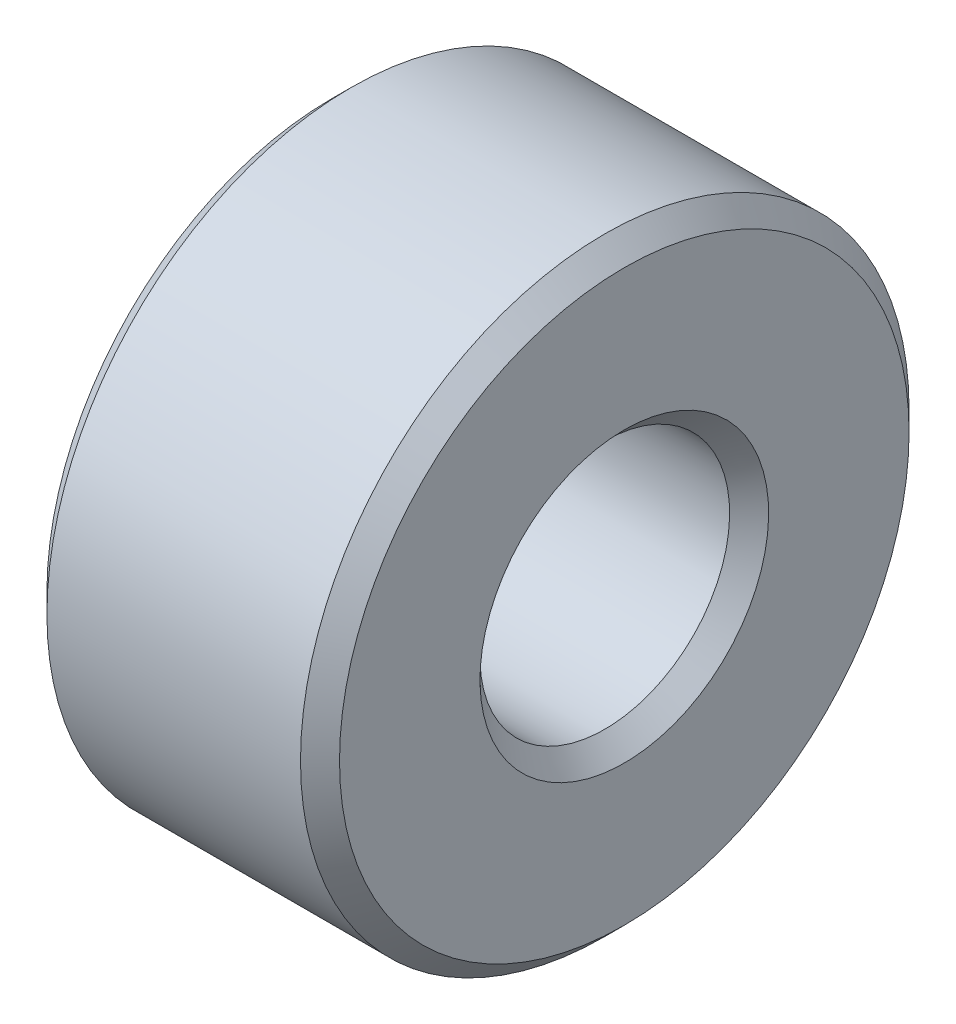
ISO-10303-21;
HEADER;
FILE_DESCRIPTION(('STEP AP214'),'2;1');
FILE_NAME('part.step','',(''),(''),'','','');
FILE_SCHEMA(('AUTOMOTIVE_DESIGN { 1 0 10303 214 1 1 1 1 }'));
ENDSEC;
DATA;
#1=APPLICATION_CONTEXT('core data for automotive mechanical design processes');
#2=APPLICATION_PROTOCOL_DEFINITION('international standard','automotive_design',2000,#1);
#3=PRODUCT_CONTEXT('',#1,'mechanical');
#4=PRODUCT('Part','Part','',(#3));
#5=PRODUCT_RELATED_PRODUCT_CATEGORY('part','',(#4));
#6=PRODUCT_DEFINITION_FORMATION('','',#4);
#7=PRODUCT_DEFINITION_CONTEXT('part definition',#1,'design');
#8=PRODUCT_DEFINITION('design','',#6,#7);
#9=PRODUCT_DEFINITION_SHAPE('','',#8);
#10=(LENGTH_UNIT() NAMED_UNIT(*) SI_UNIT(.MILLI.,.METRE.));
#11=(NAMED_UNIT(*) PLANE_ANGLE_UNIT() SI_UNIT($,.RADIAN.));
#12=(NAMED_UNIT(*) SI_UNIT($,.STERADIAN.) SOLID_ANGLE_UNIT());
#13=UNCERTAINTY_MEASURE_WITH_UNIT(LENGTH_MEASURE(1.E-05),#10,'distance_accuracy_value','');
#14=(GEOMETRIC_REPRESENTATION_CONTEXT(3) GLOBAL_UNCERTAINTY_ASSIGNED_CONTEXT((#13)) GLOBAL_UNIT_ASSIGNED_CONTEXT((#10,
#11,#12)) REPRESENTATION_CONTEXT('',''));
#15=CARTESIAN_POINT('',(0.,0.,0.));
#16=DIRECTION('',(0.,0.,1.));
#17=DIRECTION('',(1.,0.,0.));
#18=AXIS2_PLACEMENT_3D('',#15,#16,#17);
#19=CARTESIAN_POINT('',(0.0838199999999666,9.77900000000009,28.2871340506043));
#20=DIRECTION('',(1.,0.,0.));
#21=DIRECTION('',(0.,1.,0.));
#22=AXIS2_PLACEMENT_3D('',#19,#20,#21);
#23=CYLINDRICAL_SURFACE('',#22,1.6256);
#24=CARTESIAN_POINT('',(-1.567179999995,9.77900000000009,28.2871340506043));
#25=DIRECTION('',(-1.,0.,0.));
#26=DIRECTION('',(0.,-1.,0.));
#27=AXIS2_PLACEMENT_3D('',#24,#25,#26);
#28=CIRCLE('',#27,1.62559999997402);
#29=CARTESIAN_POINT('',(-1.56717999999501,8.15340000002607,28.2871340506043));
#30=VERTEX_POINT('',#29);
#31=EDGE_CURVE('E79',#30,#30,#28,.T.);
#32=ORIENTED_EDGE('',*,*,#31,.T.);
#33=EDGE_LOOP('',(#32));
#34=FACE_BOUND('',#33,.T.);
#35=CARTESIAN_POINT('',(1.73482000008107,9.77900000000009,28.2871340506043));
#36=DIRECTION('',(1.,0.,0.));
#37=DIRECTION('',(0.,1.,0.));
#38=AXIS2_PLACEMENT_3D('',#35,#36,#37);
#39=CIRCLE('',#38,1.62559999999157);
#40=CARTESIAN_POINT('',(1.73482000008107,11.4045999999917,28.2871340506043));
#41=VERTEX_POINT('',#40);
#42=EDGE_CURVE('E63',#41,#41,#39,.T.);
#43=ORIENTED_EDGE('',*,*,#42,.T.);
#44=EDGE_LOOP('',(#43));
#45=FACE_BOUND('',#44,.T.);
#46=ADVANCED_FACE('F17',(#34,#45),#23,.F.);
#47=CARTESIAN_POINT('',(1.98882000000822,9.77900000000009,28.2871340506043));
#48=DIRECTION('',(1.,0.,0.));
#49=DIRECTION('',(0.,1.,0.));
#50=AXIS2_PLACEMENT_3D('',#47,#48,#49);
#51=CONICAL_SURFACE('',#50,1.87959999991871,0.785398163397449);
#52=CARTESIAN_POINT('',(1.98881999997102,9.77900000000009,28.2871340506043));
#53=DIRECTION('',(1.,0.,0.));
#54=DIRECTION('',(0.,1.,0.));
#55=AXIS2_PLACEMENT_3D('',#52,#53,#54);
#56=CIRCLE('',#55,1.87959999988152);
#57=CARTESIAN_POINT('',(1.98881999997102,11.6585999998816,28.2871340506043));
#58=VERTEX_POINT('',#57);
#59=EDGE_CURVE('E20',#58,#58,#56,.F.);
#60=ORIENTED_EDGE('',*,*,#59,.F.);
#61=EDGE_LOOP('',(#60));
#62=FACE_BOUND('',#61,.T.);
#63=ORIENTED_EDGE('',*,*,#42,.F.);
#64=EDGE_LOOP('',(#63));
#65=FACE_BOUND('',#64,.T.);
#66=ADVANCED_FACE('F75',(#62,#65),#51,.F.);
#67=CARTESIAN_POINT('',(-1.82117999997899,9.77900000000009,28.2871340506043));
#68=DIRECTION('',(-1.,0.,0.));
#69=DIRECTION('',(0.,-1.,0.));
#70=AXIS2_PLACEMENT_3D('',#67,#68,#69);
#71=CONICAL_SURFACE('',#70,1.87959999995801,0.785398163285552);
#72=CARTESIAN_POINT('',(-1.82117999997899,9.77900000000009,28.2871340506043));
#73=DIRECTION('',(-1.,0.,0.));
#74=DIRECTION('',(0.,-1.,0.));
#75=AXIS2_PLACEMENT_3D('',#72,#73,#74);
#76=CIRCLE('',#75,1.87959999995802);
#77=CARTESIAN_POINT('',(-1.821179999979,7.89940000004208,28.2871340506043));
#78=VERTEX_POINT('',#77);
#79=EDGE_CURVE('E54',#78,#78,#76,.F.);
#80=ORIENTED_EDGE('',*,*,#79,.F.);
#81=EDGE_LOOP('',(#80));
#82=FACE_BOUND('',#81,.T.);
#83=ORIENTED_EDGE('',*,*,#31,.F.);
#84=EDGE_LOOP('',(#83));
#85=FACE_BOUND('',#84,.T.);
#86=ADVANCED_FACE('F71',(#82,#85),#71,.F.);
#87=CARTESIAN_POINT('',(1.98881999999997,9.77900000000009,28.2871340506043));
#88=DIRECTION('',(1.,0.,0.));
#89=DIRECTION('',(0.,1.,0.));
#90=AXIS2_PLACEMENT_3D('',#87,#88,#89);
#91=PLANE('',#90);
#92=ORIENTED_EDGE('',*,*,#59,.T.);
#93=EDGE_LOOP('',(#92));
#94=FACE_BOUND('',#93,.T.);
#95=CARTESIAN_POINT('',(1.98881999989453,9.77900000000009,28.2871340506043));
#96=DIRECTION('',(-1.,0.,0.));
#97=DIRECTION('',(0.,-1.,0.));
#98=AXIS2_PLACEMENT_3D('',#95,#96,#97);
#99=CIRCLE('',#98,3.70840000007011);
#100=CARTESIAN_POINT('',(1.98881999989453,6.07059999992998,28.2871340506043));
#101=VERTEX_POINT('',#100);
#102=EDGE_CURVE('E59',#101,#101,#99,.T.);
#103=ORIENTED_EDGE('',*,*,#102,.F.);
#104=EDGE_LOOP('',(#103));
#105=FACE_BOUND('',#104,.T.);
#106=ADVANCED_FACE('F74',(#94,#105),#91,.T.);
#107=CARTESIAN_POINT('',(-1.56717999993816,9.77900000000009,28.2871340506043));
#108=DIRECTION('',(1.,0.,0.));
#109=DIRECTION('',(0.,1.,0.));
#110=AXIS2_PLACEMENT_3D('',#107,#108,#109);
#111=CONICAL_SURFACE('',#110,3.9624000000148,0.785398163509345);
#112=DIRECTION('',(-0.707106781184186,0.707106781188909,0.));
#113=VECTOR('',#112,1.);
#114=CARTESIAN_POINT('',(498984.691416668,-498980.442,28.2871340506509));
#115=LINE('',#114,#113);
#116=CARTESIAN_POINT('',(-1.56717999995331,5.81660000000146,28.2871340506043));
#117=VERTEX_POINT('',#116);
#118=CARTESIAN_POINT('',(-1.82117999998777,6.07060000012016,28.2871340506043));
#119=VERTEX_POINT('',#118);
#120=EDGE_CURVE('E44',#117,#119,#115,.T.);
#121=ORIENTED_EDGE('',*,*,#120,.T.);
#122=CARTESIAN_POINT('',(-1.82118000001619,9.77900000000009,28.2871340506043));
#123=DIRECTION('',(1.,0.,0.));
#124=DIRECTION('',(0.,1.,0.));
#125=AXIS2_PLACEMENT_3D('',#122,#123,#124);
#126=CIRCLE('',#125,3.70839999987993);
#127=CARTESIAN_POINT('',(-1.82118000002601,13.4873999999084,28.2871340506043));
#128=VERTEX_POINT('',#127);
#129=EDGE_CURVE('E47',#128,#119,#126,.F.);
#130=ORIENTED_EDGE('',*,*,#129,.F.);
#131=DIRECTION('',(-0.707106781184187,-0.707106781188908,0.));
#132=VECTOR('',#131,1.);
#133=CARTESIAN_POINT('',(498984.691416668,499000.,28.2871340506043));
#134=LINE('',#133,#132);
#135=CARTESIAN_POINT('',(-1.56717999999835,13.7413999999671,28.2871340506043));
#136=VERTEX_POINT('',#135);
#137=EDGE_CURVE('E35',#128,#136,#134,.F.);
#138=ORIENTED_EDGE('',*,*,#137,.T.);
#139=CARTESIAN_POINT('',(-1.56718000000002,9.77900000000009,28.2871340506043));
#140=DIRECTION('',(1.,0.,0.));
#141=DIRECTION('',(0.,1.,0.));
#142=AXIS2_PLACEMENT_3D('',#139,#140,#141);
#143=CIRCLE('',#142,3.9624);
#144=EDGE_CURVE('E49',#117,#136,#143,.T.);
#145=ORIENTED_EDGE('',*,*,#144,.F.);
#146=EDGE_LOOP('',(#121,#130,#138,#145));
#147=FACE_BOUND('',#146,.T.);
#148=ADVANCED_FACE('F46',(#147),#111,.T.);
#149=CARTESIAN_POINT('',(-1.82118000000002,9.77900000000009,28.2871340506043));
#150=DIRECTION('',(-1.,0.,0.));
#151=DIRECTION('',(0.,-1.,0.));
#152=AXIS2_PLACEMENT_3D('',#149,#150,#151);
#153=PLANE('',#152);
#154=ORIENTED_EDGE('',*,*,#79,.T.);
#155=EDGE_LOOP('',(#154));
#156=FACE_BOUND('',#155,.T.);
#157=ORIENTED_EDGE('',*,*,#129,.T.);
#158=CARTESIAN_POINT('',(-1.821179999979,9.77900000000009,28.2871340506043));
#159=DIRECTION('',(1.,0.,0.));
#160=DIRECTION('',(0.,1.,0.));
#161=AXIS2_PLACEMENT_3D('',#158,#159,#160);
#162=CIRCLE('',#161,3.70839999991712);
#163=EDGE_CURVE('E53',#128,#119,#162,.T.);
#164=ORIENTED_EDGE('',*,*,#163,.F.);
#165=EDGE_LOOP('',(#157,#164));
#166=FACE_BOUND('',#165,.T.);
#167=ADVANCED_FACE('F52',(#156,#166),#153,.T.);
#168=CARTESIAN_POINT('',(1.73481999996739,9.77900000000009,28.2871340506043));
#169=DIRECTION('',(-1.,0.,0.));
#170=DIRECTION('',(0.,-1.,0.));
#171=AXIS2_PLACEMENT_3D('',#168,#169,#170);
#172=CONICAL_SURFACE('',#171,3.96239999999726,0.785398163397448);
#173=ORIENTED_EDGE('',*,*,#102,.T.);
#174=EDGE_LOOP('',(#173));
#175=FACE_BOUND('',#174,.T.);
#176=CARTESIAN_POINT('',(1.73481999999998,9.77900000000009,28.2871340506043));
#177=DIRECTION('',(1.,0.,0.));
#178=DIRECTION('',(0.,1.,0.));
#179=AXIS2_PLACEMENT_3D('',#176,#177,#178);
#180=CIRCLE('',#179,3.9624);
#181=CARTESIAN_POINT('',(1.73481999999998,13.7414000000001,28.2871340506043));
#182=VERTEX_POINT('',#181);
#183=EDGE_CURVE('E26',#182,#182,#180,.F.);
#184=ORIENTED_EDGE('',*,*,#183,.F.);
#185=EDGE_LOOP('',(#184));
#186=FACE_BOUND('',#185,.T.);
#187=ADVANCED_FACE('F107',(#175,#186),#172,.T.);
#188=CARTESIAN_POINT('',(-1.56717999999501,9.77900000000009,28.2871340506043));
#189=DIRECTION('',(1.,0.,0.));
#190=DIRECTION('',(0.,1.,0.));
#191=AXIS2_PLACEMENT_3D('',#188,#189,#190);
#192=CONICAL_SURFACE('',#191,3.96239999990111,0.785398163397448);
#193=ORIENTED_EDGE('',*,*,#120,.F.);
#194=CARTESIAN_POINT('',(-1.56718000000002,9.77900000000009,28.2871340506043));
#195=DIRECTION('',(1.,0.,0.));
#196=DIRECTION('',(0.,1.,0.));
#197=AXIS2_PLACEMENT_3D('',#194,#195,#196);
#198=CIRCLE('',#197,3.9624);
#199=EDGE_CURVE('E11',#136,#117,#198,.T.);
#200=ORIENTED_EDGE('',*,*,#199,.F.);
#201=ORIENTED_EDGE('',*,*,#137,.F.);
#202=ORIENTED_EDGE('',*,*,#163,.T.);
#203=EDGE_LOOP('',(#193,#200,#201,#202));
#204=FACE_BOUND('',#203,.T.);
#205=ADVANCED_FACE('F55',(#204),#192,.T.);
#206=CARTESIAN_POINT('',(0.0838199999999666,9.77900000000009,28.2871340506043));
#207=DIRECTION('',(1.,0.,0.));
#208=DIRECTION('',(0.,1.,0.));
#209=AXIS2_PLACEMENT_3D('',#206,#207,#208);
#210=CYLINDRICAL_SURFACE('',#209,3.9624);
#211=ORIENTED_EDGE('',*,*,#183,.T.);
#212=EDGE_LOOP('',(#211));
#213=FACE_BOUND('',#212,.T.);
#214=ORIENTED_EDGE('',*,*,#199,.T.);
#215=ORIENTED_EDGE('',*,*,#144,.T.);
#216=EDGE_LOOP('',(#214,#215));
#217=FACE_BOUND('',#216,.T.);
#218=ADVANCED_FACE('F101',(#213,#217),#210,.T.);
#219=CLOSED_SHELL('',(#46,#66,#86,#106,#148,#167,#187,#205,#218));
#220=MANIFOLD_SOLID_BREP('B1',#219);
#221=ADVANCED_BREP_SHAPE_REPRESENTATION('',(#18,#220),#14);
#222=SHAPE_DEFINITION_REPRESENTATION(#9,#221);
ENDSEC;
END-ISO-10303-21;
